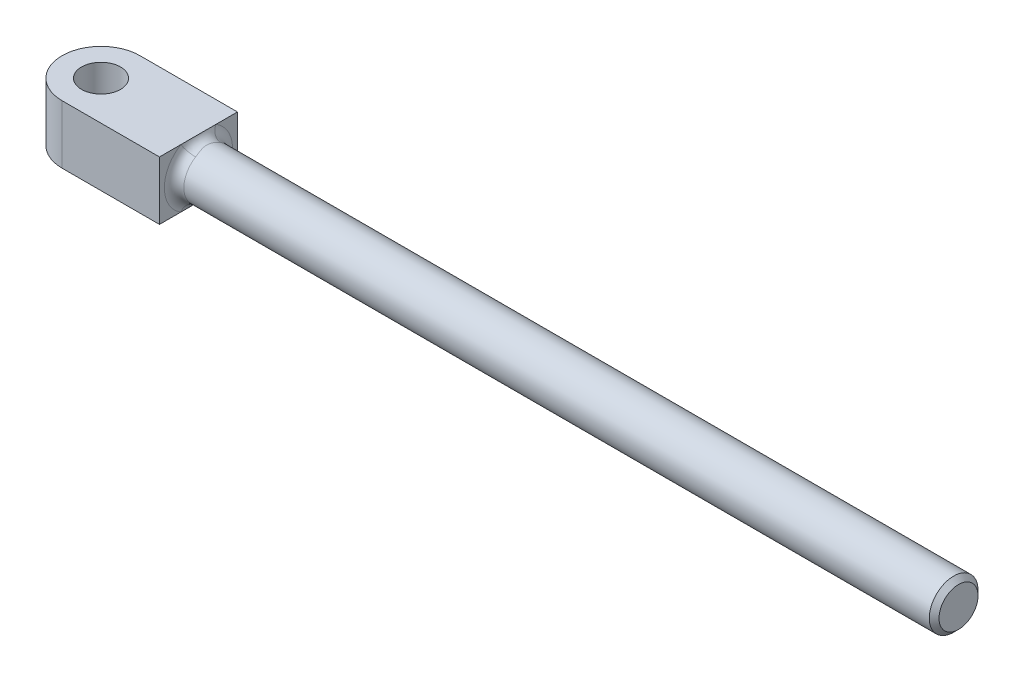
ISO-10303-21;
HEADER;
FILE_DESCRIPTION(('STEP AP214'),'2;1');
FILE_NAME('part.step','',(''),(''),'','','');
FILE_SCHEMA(('AUTOMOTIVE_DESIGN { 1 0 10303 214 1 1 1 1 }'));
ENDSEC;
DATA;
#1=APPLICATION_CONTEXT('core data for automotive mechanical design processes');
#2=APPLICATION_PROTOCOL_DEFINITION('international standard','automotive_design',2000,#1);
#3=PRODUCT_CONTEXT('',#1,'mechanical');
#4=PRODUCT('Part','Part','',(#3));
#5=PRODUCT_RELATED_PRODUCT_CATEGORY('part','',(#4));
#6=PRODUCT_DEFINITION_FORMATION('','',#4);
#7=PRODUCT_DEFINITION_CONTEXT('part definition',#1,'design');
#8=PRODUCT_DEFINITION('design','',#6,#7);
#9=PRODUCT_DEFINITION_SHAPE('','',#8);
#10=(LENGTH_UNIT() NAMED_UNIT(*) SI_UNIT(.MILLI.,.METRE.));
#11=(NAMED_UNIT(*) PLANE_ANGLE_UNIT() SI_UNIT($,.RADIAN.));
#12=(NAMED_UNIT(*) SI_UNIT($,.STERADIAN.) SOLID_ANGLE_UNIT());
#13=UNCERTAINTY_MEASURE_WITH_UNIT(LENGTH_MEASURE(1.E-05),#10,'distance_accuracy_value','');
#14=(GEOMETRIC_REPRESENTATION_CONTEXT(3) GLOBAL_UNCERTAINTY_ASSIGNED_CONTEXT((#13)) GLOBAL_UNIT_ASSIGNED_CONTEXT((#10,
#11,#12)) REPRESENTATION_CONTEXT('',''));
#15=CARTESIAN_POINT('',(0.,0.,0.));
#16=DIRECTION('',(0.,0.,1.));
#17=DIRECTION('',(1.,0.,0.));
#18=AXIS2_PLACEMENT_3D('',#15,#16,#17);
#19=CARTESIAN_POINT('',(5.,3.,-4.));
#20=DIRECTION('',(-1.,0.,0.));
#21=DIRECTION('',(0.,0.,1.));
#22=AXIS2_PLACEMENT_3D('',#19,#20,#21);
#23=PLANE('',#22);
#24=DIRECTION('',(0.,0.,-1.));
#25=VECTOR('',#24,1.);
#26=CARTESIAN_POINT('',(5.,-3.,-4.));
#27=LINE('',#26,#25);
#28=CARTESIAN_POINT('',(5.,-3.,4.));
#29=VERTEX_POINT('',#28);
#30=CARTESIAN_POINT('',(5.,-3.,1.802775637732));
#31=VERTEX_POINT('',#30);
#32=EDGE_CURVE('E259',#29,#31,#27,.T.);
#33=ORIENTED_EDGE('',*,*,#32,.T.);
#34=CARTESIAN_POINT('',(5.,0.,0.));
#35=DIRECTION('',(-1.,0.,0.));
#36=DIRECTION('',(0.,0.,1.));
#37=AXIS2_PLACEMENT_3D('',#34,#35,#36);
#38=CIRCLE('',#37,3.5);
#39=CARTESIAN_POINT('',(5.,3.,1.802775637732));
#40=VERTEX_POINT('',#39);
#41=EDGE_CURVE('E77',#31,#40,#38,.T.);
#42=ORIENTED_EDGE('',*,*,#41,.T.);
#43=DIRECTION('',(0.,0.,-1.));
#44=VECTOR('',#43,1.);
#45=CARTESIAN_POINT('',(5.,3.,-4.));
#46=LINE('',#45,#44);
#47=CARTESIAN_POINT('',(5.,3.,4.));
#48=VERTEX_POINT('',#47);
#49=EDGE_CURVE('E130',#48,#40,#46,.T.);
#50=ORIENTED_EDGE('',*,*,#49,.F.);
#51=DIRECTION('',(0.,-1.,0.));
#52=VECTOR('',#51,1.);
#53=CARTESIAN_POINT('',(5.,3.,4.));
#54=LINE('',#53,#52);
#55=EDGE_CURVE('E261',#48,#29,#54,.T.);
#56=ORIENTED_EDGE('',*,*,#55,.T.);
#57=EDGE_LOOP('',(#33,#42,#50,#56));
#58=FACE_BOUND('',#57,.T.);
#59=ADVANCED_FACE('F52',(#58),#23,.F.);
#60=CARTESIAN_POINT('',(-5.,3.,0.));
#61=DIRECTION('',(0.,1.,0.));
#62=DIRECTION('',(0.,0.,1.));
#63=AXIS2_PLACEMENT_3D('',#60,#61,#62);
#64=PLANE('',#63);
#65=ORIENTED_EDGE('',*,*,#49,.T.);
#66=CARTESIAN_POINT('',(5.,3.,-1.802775637732));
#67=VERTEX_POINT('',#66);
#68=EDGE_CURVE('E125',#40,#67,#46,.T.);
#69=ORIENTED_EDGE('',*,*,#68,.T.);
#70=CARTESIAN_POINT('',(5.,3.,-4.));
#71=VERTEX_POINT('',#70);
#72=EDGE_CURVE('E69',#67,#71,#46,.T.);
#73=ORIENTED_EDGE('',*,*,#72,.T.);
#74=DIRECTION('',(-1.,0.,0.));
#75=VECTOR('',#74,1.);
#76=CARTESIAN_POINT('',(-5.,3.,-4.));
#77=LINE('',#76,#75);
#78=CARTESIAN_POINT('',(-5.,3.,-4.));
#79=VERTEX_POINT('',#78);
#80=EDGE_CURVE('E122',#71,#79,#77,.T.);
#81=ORIENTED_EDGE('',*,*,#80,.T.);
#82=CARTESIAN_POINT('',(-5.,3.,0.));
#83=DIRECTION('',(0.,1.,0.));
#84=DIRECTION('',(0.,0.,1.));
#85=AXIS2_PLACEMENT_3D('',#82,#83,#84);
#86=CIRCLE('',#85,4.);
#87=CARTESIAN_POINT('',(-5.,3.,4.));
#88=VERTEX_POINT('',#87);
#89=EDGE_CURVE('E139',#79,#88,#86,.T.);
#90=ORIENTED_EDGE('',*,*,#89,.T.);
#91=DIRECTION('',(1.,0.,0.));
#92=VECTOR('',#91,1.);
#93=CARTESIAN_POINT('',(-5.,3.,4.));
#94=LINE('',#93,#92);
#95=EDGE_CURVE('E289',#88,#48,#94,.T.);
#96=ORIENTED_EDGE('',*,*,#95,.T.);
#97=EDGE_LOOP('',(#65,#69,#73,#81,#90,#96));
#98=FACE_BOUND('',#97,.T.);
#99=CARTESIAN_POINT('',(-5.,3.,0.));
#100=DIRECTION('',(0.,1.,0.));
#101=DIRECTION('',(0.,0.,1.));
#102=AXIS2_PLACEMENT_3D('',#99,#100,#101);
#103=CIRCLE('',#102,2.);
#104=CARTESIAN_POINT('',(-5.,3.,2.));
#105=VERTEX_POINT('',#104);
#106=EDGE_CURVE('E275',#105,#105,#103,.T.);
#107=ORIENTED_EDGE('',*,*,#106,.F.);
#108=EDGE_LOOP('',(#107));
#109=FACE_BOUND('',#108,.T.);
#110=ADVANCED_FACE('F120',(#98,#109),#64,.T.);
#111=CARTESIAN_POINT('',(-5.,-3.,0.));
#112=DIRECTION('',(0.,1.,0.));
#113=DIRECTION('',(0.,0.,1.));
#114=AXIS2_PLACEMENT_3D('',#111,#112,#113);
#115=PLANE('',#114);
#116=ORIENTED_EDGE('',*,*,#32,.F.);
#117=DIRECTION('',(1.,0.,0.));
#118=VECTOR('',#117,1.);
#119=CARTESIAN_POINT('',(-5.,-3.,4.));
#120=LINE('',#119,#118);
#121=CARTESIAN_POINT('',(-5.,-3.,4.));
#122=VERTEX_POINT('',#121);
#123=EDGE_CURVE('E128',#122,#29,#120,.T.);
#124=ORIENTED_EDGE('',*,*,#123,.F.);
#125=CARTESIAN_POINT('',(-5.,-3.,0.));
#126=DIRECTION('',(0.,1.,0.));
#127=DIRECTION('',(0.,0.,1.));
#128=AXIS2_PLACEMENT_3D('',#125,#126,#127);
#129=CIRCLE('',#128,4.);
#130=CARTESIAN_POINT('',(-5.,-3.,-4.));
#131=VERTEX_POINT('',#130);
#132=EDGE_CURVE('E270',#131,#122,#129,.T.);
#133=ORIENTED_EDGE('',*,*,#132,.F.);
#134=DIRECTION('',(-1.,0.,0.));
#135=VECTOR('',#134,1.);
#136=CARTESIAN_POINT('',(-5.,-3.,-4.));
#137=LINE('',#136,#135);
#138=CARTESIAN_POINT('',(5.,-3.,-4.));
#139=VERTEX_POINT('',#138);
#140=EDGE_CURVE('E265',#139,#131,#137,.T.);
#141=ORIENTED_EDGE('',*,*,#140,.F.);
#142=CARTESIAN_POINT('',(5.,-3.,-1.802775637732));
#143=VERTEX_POINT('',#142);
#144=EDGE_CURVE('E143',#143,#139,#27,.T.);
#145=ORIENTED_EDGE('',*,*,#144,.F.);
#146=EDGE_CURVE('E266',#31,#143,#27,.T.);
#147=ORIENTED_EDGE('',*,*,#146,.F.);
#148=EDGE_LOOP('',(#116,#124,#133,#141,#145,#147));
#149=FACE_BOUND('',#148,.T.);
#150=CARTESIAN_POINT('',(-5.,-3.,0.));
#151=DIRECTION('',(0.,1.,0.));
#152=DIRECTION('',(0.,0.,1.));
#153=AXIS2_PLACEMENT_3D('',#150,#151,#152);
#154=CIRCLE('',#153,2.);
#155=CARTESIAN_POINT('',(-5.,-3.,2.));
#156=VERTEX_POINT('',#155);
#157=EDGE_CURVE('E278',#156,#156,#154,.T.);
#158=ORIENTED_EDGE('',*,*,#157,.T.);
#159=EDGE_LOOP('',(#158));
#160=FACE_BOUND('',#159,.T.);
#161=ADVANCED_FACE('F235',(#149,#160),#115,.F.);
#162=ORIENTED_EDGE('',*,*,#72,.F.);
#163=CARTESIAN_POINT('',(5.,0.,0.));
#164=DIRECTION('',(-1.,0.,0.));
#165=DIRECTION('',(0.,0.,1.));
#166=AXIS2_PLACEMENT_3D('',#163,#164,#165);
#167=CIRCLE('',#166,3.5);
#168=EDGE_CURVE('E206',#67,#143,#167,.T.);
#169=ORIENTED_EDGE('',*,*,#168,.T.);
#170=ORIENTED_EDGE('',*,*,#144,.T.);
#171=DIRECTION('',(0.,-1.,0.));
#172=VECTOR('',#171,1.);
#173=CARTESIAN_POINT('',(5.,3.,-4.));
#174=LINE('',#173,#172);
#175=EDGE_CURVE('E134',#71,#139,#174,.T.);
#176=ORIENTED_EDGE('',*,*,#175,.F.);
#177=EDGE_LOOP('',(#162,#169,#170,#176));
#178=FACE_BOUND('',#177,.T.);
#179=ADVANCED_FACE('F141',(#178),#23,.F.);
#180=CARTESIAN_POINT('',(-5.,3.,-4.));
#181=DIRECTION('',(0.,0.,1.));
#182=DIRECTION('',(1.,0.,0.));
#183=AXIS2_PLACEMENT_3D('',#180,#181,#182);
#184=PLANE('',#183);
#185=ORIENTED_EDGE('',*,*,#140,.T.);
#186=DIRECTION('',(0.,-1.,0.));
#187=VECTOR('',#186,1.);
#188=CARTESIAN_POINT('',(-5.,3.,-4.));
#189=LINE('',#188,#187);
#190=EDGE_CURVE('E136',#79,#131,#189,.T.);
#191=ORIENTED_EDGE('',*,*,#190,.F.);
#192=ORIENTED_EDGE('',*,*,#80,.F.);
#193=ORIENTED_EDGE('',*,*,#175,.T.);
#194=EDGE_LOOP('',(#185,#191,#192,#193));
#195=FACE_BOUND('',#194,.T.);
#196=ADVANCED_FACE('F133',(#195),#184,.F.);
#197=CARTESIAN_POINT('',(-5.,3.,0.));
#198=DIRECTION('',(0.,-1.,0.));
#199=DIRECTION('',(0.,0.,-1.));
#200=AXIS2_PLACEMENT_3D('',#197,#198,#199);
#201=CYLINDRICAL_SURFACE('',#200,4.);
#202=ORIENTED_EDGE('',*,*,#132,.T.);
#203=DIRECTION('',(0.,-1.,0.));
#204=VECTOR('',#203,1.);
#205=CARTESIAN_POINT('',(-5.,3.,4.));
#206=LINE('',#205,#204);
#207=EDGE_CURVE('E152',#88,#122,#206,.T.);
#208=ORIENTED_EDGE('',*,*,#207,.F.);
#209=ORIENTED_EDGE('',*,*,#89,.F.);
#210=ORIENTED_EDGE('',*,*,#190,.T.);
#211=EDGE_LOOP('',(#202,#208,#209,#210));
#212=FACE_BOUND('',#211,.T.);
#213=ADVANCED_FACE('F245',(#212),#201,.T.);
#214=CARTESIAN_POINT('',(-5.,3.,4.));
#215=DIRECTION('',(0.,0.,-1.));
#216=DIRECTION('',(-1.,0.,0.));
#217=AXIS2_PLACEMENT_3D('',#214,#215,#216);
#218=PLANE('',#217);
#219=ORIENTED_EDGE('',*,*,#123,.T.);
#220=ORIENTED_EDGE('',*,*,#55,.F.);
#221=ORIENTED_EDGE('',*,*,#95,.F.);
#222=ORIENTED_EDGE('',*,*,#207,.T.);
#223=EDGE_LOOP('',(#219,#220,#221,#222));
#224=FACE_BOUND('',#223,.T.);
#225=ADVANCED_FACE('F241',(#224),#218,.F.);
#226=CARTESIAN_POINT('',(-5.,3.,0.));
#227=DIRECTION('',(0.,-1.,0.));
#228=DIRECTION('',(0.,0.,-1.));
#229=AXIS2_PLACEMENT_3D('',#226,#227,#228);
#230=CYLINDRICAL_SURFACE('',#229,2.);
#231=ORIENTED_EDGE('',*,*,#106,.T.);
#232=EDGE_LOOP('',(#231));
#233=FACE_BOUND('',#232,.T.);
#234=ORIENTED_EDGE('',*,*,#157,.F.);
#235=EDGE_LOOP('',(#234));
#236=FACE_BOUND('',#235,.T.);
#237=ADVANCED_FACE('F244',(#233,#236),#230,.F.);
#238=CARTESIAN_POINT('',(83.,0.,0.));
#239=DIRECTION('',(-1.,0.,0.));
#240=DIRECTION('',(0.,0.,1.));
#241=AXIS2_PLACEMENT_3D('',#238,#239,#240);
#242=CYLINDRICAL_SURFACE('',#241,2.5);
#243=CARTESIAN_POINT('',(82.5,0.,0.));
#244=DIRECTION('',(1.,0.,0.));
#245=DIRECTION('',(0.,0.,-1.));
#246=AXIS2_PLACEMENT_3D('',#243,#244,#245);
#247=CIRCLE('',#246,2.5);
#248=CARTESIAN_POINT('',(82.5,0.,-2.5));
#249=VERTEX_POINT('',#248);
#250=EDGE_CURVE('E11',#249,#249,#247,.F.);
#251=ORIENTED_EDGE('',*,*,#250,.T.);
#252=EDGE_LOOP('',(#251));
#253=FACE_BOUND('',#252,.T.);
#254=CARTESIAN_POINT('',(6.00000000000001,0.,0.));
#255=DIRECTION('',(-1.,0.,0.));
#256=DIRECTION('',(0.,0.,1.));
#257=AXIS2_PLACEMENT_3D('',#254,#255,#256);
#258=CIRCLE('',#257,2.5);
#259=CARTESIAN_POINT('',(6.00000000000001,2.14285714285714,1.28769688409428));
#260=VERTEX_POINT('',#259);
#261=CARTESIAN_POINT('',(6.00000000000001,-2.14285714285714,1.28769688409428));
#262=VERTEX_POINT('',#261);
#263=EDGE_CURVE('E146',#260,#262,#258,.F.);
#264=ORIENTED_EDGE('',*,*,#263,.T.);
#265=CARTESIAN_POINT('',(5.91020288191499,-1.84702666727615,1.68478262407076));
#266=CARTESIAN_POINT('',(4.59869441592253,-2.11805305184009,1.38765648288614));
#267=CARTESIAN_POINT('',(5.,-3.,2.35869567369907));
#268=CARTESIAN_POINT('',(5.92496343228494,-1.87021882017818,1.65936827293122));
#269=CARTESIAN_POINT('',(4.62986210905236,-2.10409965880879,1.39485788528736));
#270=CARTESIAN_POINT('',(5.,-3.,2.32311558212302));
#271=CARTESIAN_POINT('',(5.93750394487437,-1.89317065476329,1.63314087938531));
#272=CARTESIAN_POINT('',(4.66216951097915,-2.09472768310197,1.39873123079867));
#273=CARTESIAN_POINT('',(5.,-3.,2.28639723116134));
#274=CARTESIAN_POINT('',(5.9586878351196,-1.93827997476054,1.57933264082472));
#275=CARTESIAN_POINT('',(4.72603124317857,-2.08398106756867,1.3997411936574));
#276=CARTESIAN_POINT('',(5.,-3.,2.21106569716946));
#277=CARTESIAN_POINT('',(5.96733950302814,-1.96043905638494,1.55175481528735));
#278=CARTESIAN_POINT('',(4.7575996380689,-2.08237228525282,1.39707606759514));
#279=CARTESIAN_POINT('',(5.,-3.,2.17245674140751));
#280=CARTESIAN_POINT('',(5.98818923016375,-2.02490711609744,1.46788389797564));
#281=CARTESIAN_POINT('',(4.84683976080201,-2.08663625544711,1.38007393620703));
#282=CARTESIAN_POINT('',(5.,-3.,2.05503745715558));
#283=CARTESIAN_POINT('',(5.99559473562002,-2.06575259890432,1.4098581487003));
#284=CARTESIAN_POINT('',(4.90262476341262,-2.10056168474141,1.35734706621003));
#285=CARTESIAN_POINT('',(5.,-3.,1.97380140817703));
#286=CARTESIAN_POINT('',(6.00330042816297,-2.16653078185199,1.25280520925142));
#287=CARTESIAN_POINT('',(5.02820675299698,-2.1515106641981,1.27354998841387));
#288=CARTESIAN_POINT('',(5.,-3.,1.7539272929575));
#289=CARTESIAN_POINT('',(5.99618550299054,-2.22227780908099,1.15097658677616));
#290=CARTESIAN_POINT('',(5.09053797539367,-2.19733566368004,1.19776380716158));
#291=CARTESIAN_POINT('',(5.,-3.,1.61136722148822));
#292=CARTESIAN_POINT('',(5.97148576493426,-2.31925618416503,0.940546919485264));
#293=CARTESIAN_POINT('',(5.18217074895344,-2.28776397044253,1.01589565420035));
#294=CARTESIAN_POINT('',(5.,-3.,1.31676568727776));
#295=CARTESIAN_POINT('',(5.9538221499825,-2.36037452380378,0.831900466571046));
#296=CARTESIAN_POINT('',(5.21371547929332,-2.33312424012959,0.909812051412263));
#297=CARTESIAN_POINT('',(5.,-3.,1.16466065319861));
#298=CARTESIAN_POINT('',(5.92684174644988,-2.41171212801428,0.661443155926719));
#299=CARTESIAN_POINT('',(5.24710827546709,-2.39215410620666,0.732933207563483));
#300=CARTESIAN_POINT('',(5.,-3.,0.926020418297864));
#301=CARTESIAN_POINT('',(5.91744778909948,-2.4274223778965,0.601243759095363));
#302=CARTESIAN_POINT('',(5.25603652297671,-2.41075944684107,0.669088597460024));
#303=CARTESIAN_POINT('',(5.,-3.,0.841741262734452));
#304=CARTESIAN_POINT('',(5.90015966588189,-2.45432605473145,0.47974293897492));
#305=CARTESIAN_POINT('',(5.26996413549231,-2.44303860810299,0.53801459854561));
#306=CARTESIAN_POINT('',(5.,-3.,0.671640114565451));
#307=CARTESIAN_POINT('',(5.89226494845164,-2.46552114449967,0.418441930084311));
#308=CARTESIAN_POINT('',(5.27505468518386,-2.45686188645872,0.470525326937788));
#309=CARTESIAN_POINT('',(5.,-3.,0.585818702117733));
#310=CARTESIAN_POINT('',(5.87924112034305,-2.483274322633,0.29529717472753));
#311=CARTESIAN_POINT('',(5.28255920825161,-2.47886682684453,0.333738205015902));
#312=CARTESIAN_POINT('',(5.,-3.,0.413416044618842));
#313=CARTESIAN_POINT('',(5.87409989352878,-2.48985276592176,0.233457043445556));
#314=CARTESIAN_POINT('',(5.28502791136934,-2.48717845577119,0.264142380679086));
#315=CARTESIAN_POINT('',(5.,-3.,0.326839860825534));
#316=CARTESIAN_POINT('',(5.86735762256748,-2.49838093998099,0.109361414969639));
#317=CARTESIAN_POINT('',(5.28813452010592,-2.49792896303268,0.124128201815257));
#318=CARTESIAN_POINT('',(5.,-3.,0.153105980955934));
#319=CARTESIAN_POINT('',(5.86575622999703,-2.50033112630897,0.0471059592608767));
#320=CARTESIAN_POINT('',(5.28878856741919,-2.5004215525342,0.0533690862010075));
#321=CARTESIAN_POINT('',(5.,-3.,0.0659483429588961));
#322=CARTESIAN_POINT('',(5.8663860932462,-2.49955575223616,-0.0809249677260196));
#323=CARTESIAN_POINT('',(5.28852252488525,-2.4994348313836,-0.0917267287856602));
#324=CARTESIAN_POINT('',(5.,-3.,-0.113294954809735));
#325=CARTESIAN_POINT('',(5.86884135439051,-2.49655692159848,-0.146698507289042));
#326=CARTESIAN_POINT('',(5.2875088539224,-2.49560052172953,-0.166438542504325));
#327=CARTESIAN_POINT('',(5.,-3.,-0.205377910178868));
#328=CARTESIAN_POINT('',(5.87754879251577,-2.48540146107994,-0.277672408532099));
#329=CARTESIAN_POINT('',(5.28333321167597,-2.48158959625075,-0.31385914306642));
#330=CARTESIAN_POINT('',(5.,-3.,-0.388741371970735));
#331=CARTESIAN_POINT('',(5.88380174160464,-2.47724378233976,-0.342872650919743));
#332=CARTESIAN_POINT('',(5.28014630499308,-2.4713346985524,-0.386964129925101));
#333=CARTESIAN_POINT('',(5.,-3.,-0.48002171138414));
#334=CARTESIAN_POINT('',(5.9067535989772,-2.44504355931936,-0.537749623298494));
#335=CARTESIAN_POINT('',(5.26574658259074,-2.43139912857671,-0.603266803000667));
#336=CARTESIAN_POINT('',(5.,-3.,-0.752849472792674));
#337=CARTESIAN_POINT('',(5.9276210150678,-2.41327985383661,-0.665936276663958));
#338=CARTESIAN_POINT('',(5.24942937222351,-2.39210640783797,-0.742186068976898));
#339=CARTESIAN_POINT('',(5.,-3.,-0.932310787375716));
#340=CARTESIAN_POINT('',(5.96740107221333,-2.32918194316109,-0.918065057160637));
#341=CARTESIAN_POINT('',(5.19012910848363,-2.29892237927613,-0.995192101211767));
#342=CARTESIAN_POINT('',(5.,-3.,-1.28529107997795));
#343=CARTESIAN_POINT('',(5.98627540446999,-2.27651421506209,-1.04190105099421));
#344=CARTESIAN_POINT('',(5.14470341554164,-2.24305314597983,-1.11025639067919));
#345=CARTESIAN_POINT('',(5.,-3.,-1.45866147138321));
#346=CARTESIAN_POINT('',(5.99934388681071,-2.18316948515408,-1.21991874616668));
#347=CARTESIAN_POINT('',(5.04729986055641,-2.16884641960793,-1.24485988487909));
#348=CARTESIAN_POINT('',(5.,-3.,-1.70788624463765));
#349=CARTESIAN_POINT('',(6.00118841159584,-2.14987102325301,-1.27769153842256));
#350=CARTESIAN_POINT('',(5.00851870693981,-2.14508379161501,-1.28423049414725));
#351=CARTESIAN_POINT('',(5.,-3.,-1.78876815379293));
#352=CARTESIAN_POINT('',(5.9972190475764,-2.07884509209171,-1.39025899402647));
#353=CARTESIAN_POINT('',(4.91978717962577,-2.10631330259422,-1.34781643223735));
#354=CARTESIAN_POINT('',(5.,-3.,-1.94636259163614));
#355=CARTESIAN_POINT('',(5.99141783619588,-2.04112504867188,-1.44505843077799));
#356=CARTESIAN_POINT('',(4.86917231701612,-2.09160274518387,-1.37150981875895));
#357=CARTESIAN_POINT('',(5.,-3.,-2.02308180308895));
#358=CARTESIAN_POINT('',(5.97128642113735,-1.96987321995236,-1.54025161223535));
#359=CARTESIAN_POINT('',(4.77065378194111,-2.081200774338,-1.39659640419796));
#360=CARTESIAN_POINT('',(5.,-3.,-2.15635225712968));
#361=CARTESIAN_POINT('',(5.9588898280832,-1.93700833370555,-1.58133744408648));
#362=CARTESIAN_POINT('',(4.72351901225179,-2.08277430752351,-1.4010425557338));
#363=CARTESIAN_POINT('',(5.,-3.,-2.21387242172116));
#364=CARTESIAN_POINT('',(5.92518593152543,-1.86941106524607,-1.66075648332884));
#365=CARTESIAN_POINT('',(4.62816871386315,-2.10297416756327,-1.39609191158888));
#366=CARTESIAN_POINT('',(5.,-3.,-2.32505907666029));
#367=CARTESIAN_POINT('',(5.9037801911845,-1.83466186451649,-1.69905362584827));
#368=CARTESIAN_POINT('',(4.57997532214237,-2.12254536468004,-1.38591811782259));
#369=CARTESIAN_POINT('',(5.,-3.,-2.37867507618738));
#370=CARTESIAN_POINT('',(5.87696910277394,-1.79960945399661,-1.73534025859082));
#371=CARTESIAN_POINT('',(4.53620463073676,-2.15360119143179,-1.36823825990708));
#372=CARTESIAN_POINT('',(5.,-3.,-2.42947636202714));
#373=(BOUNDED_SURFACE() B_SPLINE_SURFACE(3,2,((#265,#266,#267),(#268,#269,#270),(#271,#272,
#273),(#274,#275,#276),(#277,#278,#279),(#280,#281,#282),(#283,#284,#285),(#286,#287,#288),
(#289,#290,#291),(#292,#293,#294),(#295,#296,#297),(#298,#299,#300),(#301,#302,#303),(#304,#305,
#306),(#307,#308,#309),(#310,#311,#312),(#313,#314,#315),(#316,#317,#318),(#319,#320,#321),
(#322,#323,#324),(#325,#326,#327),(#328,#329,#330),(#331,#332,#333),(#334,#335,#336),(#337,#338,
#339),(#340,#341,#342),(#343,#344,#345),(#346,#347,#348),(#349,#350,#351),(#352,#353,#354),
(#355,#356,#357),(#358,#359,#360),(#361,#362,#363),(#364,#365,#366),(#367,#368,#369),(#370,#371,
#372)),.UNSPECIFIED.,.F.,.F.,.F.) B_SPLINE_SURFACE_WITH_KNOTS((4,2,2,2,2,2,2,2,2,2,2,2,2,2,2,2,
2,4),(3,3),(0.,0.150978452111825,0.301633503365172,0.599468504271147,1.08493079559651,
1.57406582227359,1.8366775824167,2.09919254100668,2.36054266600817,2.62186706535211,
2.89810917700126,3.17440747024341,3.73017973784788,4.29520076320603,4.57485505395893,
4.85404623174445,5.07750820983559,5.3034779297145),(0.,1.),
.UNSPECIFIED.) GEOMETRIC_REPRESENTATION_ITEM() RATIONAL_B_SPLINE_SURFACE(((1.,0.589072238635039,
1.),(1.,0.597621981679867,1.),(1.,0.606281072137649,1.),(1.,0.623622640940448,1.),(1.,
0.632305029457275,1.),(1.,0.657952795370193,1.),(1.,0.674723639585423,1.),(1.,0.716899899837878,
1.),(1.,0.741089115601709,1.),(1.,0.783806931119416,1.),(1.,0.802291321337426,1.),(1.,
0.825548340664814,1.),(1.,0.832706660558893,1.),(1.,0.845003938290568,1.),(1.,0.850143639514368,
1.),(1.,0.858307963303753,1.),(1.,0.861341869719554,1.),(1.,0.865276991795517,1.),(1.,
0.866178417354905,1.),(1.,0.865820137657809,1.),(1.,0.864434126698028,1.),(1.,0.859289909346192,
1.),(1.,0.855531220558889,1.),(1.,0.840741031559037,1.),(1.,0.826198716210335,1.),(1.,
0.788270185201537,1.),(1.,0.764740823018141,1.),(1.,0.724264523444224,1.),(1.,0.709994983454139,
1.),(1.,0.680153160391985,1.),(1.,0.664583073820699,1.),(1.,0.635979859402373,1.),(1.,
0.623060704128207,1.),(1.,0.597254296383174,1.),(1.,0.58436902895135,1.),(1.,0.571874723989394,1.))) REPRESENTATION_ITEM('') SURFACE());
#374=CARTESIAN_POINT('',(5.91020288191499,-1.84702666727615,1.68478262407076));
#375=CARTESIAN_POINT('',(5.92496343228494,-1.87021882017818,1.65936827293122));
#376=CARTESIAN_POINT('',(5.93750394487437,-1.89317065476329,1.63314087938531));
#377=CARTESIAN_POINT('',(5.9586878351196,-1.93827997476054,1.57933264082472));
#378=CARTESIAN_POINT('',(5.96733950302814,-1.96043905638494,1.55175481528735));
#379=CARTESIAN_POINT('',(5.98818923016375,-2.02490711609744,1.46788389797564));
#380=CARTESIAN_POINT('',(5.99559473562002,-2.06575259890432,1.4098581487003));
#381=CARTESIAN_POINT('',(6.00330042816297,-2.16653078185199,1.25280520925142));
#382=CARTESIAN_POINT('',(5.99618550299054,-2.22227780908099,1.15097658677616));
#383=CARTESIAN_POINT('',(5.97148576493426,-2.31925618416503,0.940546919485264));
#384=CARTESIAN_POINT('',(5.9538221499825,-2.36037452380378,0.831900466571046));
#385=CARTESIAN_POINT('',(5.92684174644988,-2.41171212801428,0.661443155926719));
#386=CARTESIAN_POINT('',(5.91744778909948,-2.4274223778965,0.601243759095364));
#387=CARTESIAN_POINT('',(5.90015966588189,-2.45432605473145,0.47974293897492));
#388=CARTESIAN_POINT('',(5.89226494845164,-2.46552114449967,0.418441930084311));
#389=CARTESIAN_POINT('',(5.87924112034305,-2.483274322633,0.29529717472753));
#390=CARTESIAN_POINT('',(5.87409989352878,-2.48985276592176,0.233457043445556));
#391=CARTESIAN_POINT('',(5.86735762256748,-2.49838093998099,0.109361414969639));
#392=CARTESIAN_POINT('',(5.86575622999703,-2.50033112630897,0.0471059592608767));
#393=CARTESIAN_POINT('',(5.8663860932462,-2.49955575223616,-0.0809249677260196));
#394=CARTESIAN_POINT('',(5.86884135439051,-2.49655692159848,-0.146698507289042));
#395=CARTESIAN_POINT('',(5.87754879251577,-2.48540146107994,-0.277672408532099));
#396=CARTESIAN_POINT('',(5.88380174160464,-2.47724378233976,-0.342872650919743));
#397=CARTESIAN_POINT('',(5.9067535989772,-2.44504355931936,-0.537749623298494));
#398=CARTESIAN_POINT('',(5.92762101506779,-2.41327985383661,-0.665936276663958));
#399=CARTESIAN_POINT('',(5.96740107221333,-2.32918194316109,-0.918065057160637));
#400=CARTESIAN_POINT('',(5.98627540446999,-2.27651421506209,-1.04190105099421));
#401=CARTESIAN_POINT('',(5.99934388681071,-2.18316948515408,-1.21991874616668));
#402=CARTESIAN_POINT('',(6.00118841159584,-2.14987102325301,-1.27769153842256));
#403=CARTESIAN_POINT('',(5.9972190475764,-2.07884509209171,-1.39025899402647));
#404=CARTESIAN_POINT('',(5.99141783619588,-2.04112504867188,-1.44505843077799));
#405=CARTESIAN_POINT('',(5.97128642113735,-1.96987321995236,-1.54025161223535));
#406=CARTESIAN_POINT('',(5.9588898280832,-1.93700833370555,-1.58133744408648));
#407=CARTESIAN_POINT('',(5.92518593152543,-1.86941106524607,-1.66075648332884));
#408=CARTESIAN_POINT('',(5.9037801911845,-1.83466186451649,-1.69905362584827));
#409=CARTESIAN_POINT('',(5.87696910277394,-1.79960945399661,-1.73534025859082));
#410=B_SPLINE_CURVE_WITH_KNOTS('',3,(#374,#375,#376,#377,#378,#379,#380,#381,#382,#383,#384,
#385,#386,#387,#388,#389,#390,#391,#392,#393,#394,#395,#396,#397,#398,#399,#400,#401,#402,#403,
#404,#405,#406,#407,#408,#409),.UNSPECIFIED.,.F.,.F.,(4,2,2,2,2,2,2,2,2,2,2,2,2,2,2,2,2,4),(0.,
0.150978452111825,0.301633503365172,0.599468504271147,1.08493079559651,1.57406582227359,
1.8366775824167,2.09919254100668,2.36054266600817,2.62186706535211,2.89810917700126,
3.17440747024341,3.73017973784788,4.29520076320603,4.57485505395893,4.85404623174445,
5.07750820983559,5.3034779297145),.UNSPECIFIED.);
#411=CARTESIAN_POINT('',(6.00000000000001,-2.14285714285714,-1.28769688409428));
#412=VERTEX_POINT('',#411);
#413=EDGE_CURVE('E209',#262,#412,#410,.T.);
#414=ORIENTED_EDGE('',*,*,#413,.T.);
#415=CARTESIAN_POINT('',(6.00000000000001,0.,0.));
#416=DIRECTION('',(-1.,0.,0.));
#417=DIRECTION('',(0.,0.,1.));
#418=AXIS2_PLACEMENT_3D('',#415,#416,#417);
#419=CIRCLE('',#418,2.5);
#420=CARTESIAN_POINT('',(6.00000000000001,2.14285714285714,-1.28769688409428));
#421=VERTEX_POINT('',#420);
#422=EDGE_CURVE('E164',#412,#421,#419,.F.);
#423=ORIENTED_EDGE('',*,*,#422,.T.);
#424=CARTESIAN_POINT('',(5.91020288191499,1.84702666727615,-1.68478262407076));
#425=CARTESIAN_POINT('',(4.59869441592253,2.11805305184009,-1.38765648288614));
#426=CARTESIAN_POINT('',(5.,3.,-2.35869567369907));
#427=CARTESIAN_POINT('',(5.92496343228494,1.87021882017818,-1.65936827293122));
#428=CARTESIAN_POINT('',(4.62986210905236,2.10409965880879,-1.39485788528736));
#429=CARTESIAN_POINT('',(5.,3.,-2.32311558212302));
#430=CARTESIAN_POINT('',(5.93750394487437,1.89317065476329,-1.63314087938531));
#431=CARTESIAN_POINT('',(4.66216951097915,2.09472768310197,-1.39873123079867));
#432=CARTESIAN_POINT('',(5.,3.,-2.28639723116134));
#433=CARTESIAN_POINT('',(5.9586878351196,1.93827997476054,-1.57933264082472));
#434=CARTESIAN_POINT('',(4.72603124317857,2.08398106756867,-1.3997411936574));
#435=CARTESIAN_POINT('',(5.,3.,-2.21106569716946));
#436=CARTESIAN_POINT('',(5.96733950302814,1.96043905638494,-1.55175481528735));
#437=CARTESIAN_POINT('',(4.7575996380689,2.08237228525282,-1.39707606759514));
#438=CARTESIAN_POINT('',(5.,3.,-2.17245674140751));
#439=CARTESIAN_POINT('',(5.98818923016375,2.02490711609744,-1.46788389797564));
#440=CARTESIAN_POINT('',(4.84683976080201,2.08663625544711,-1.38007393620703));
#441=CARTESIAN_POINT('',(5.,3.,-2.05503745715558));
#442=CARTESIAN_POINT('',(5.99559473562002,2.06575259890432,-1.4098581487003));
#443=CARTESIAN_POINT('',(4.90262476341262,2.10056168474141,-1.35734706621003));
#444=CARTESIAN_POINT('',(5.,3.,-1.97380140817704));
#445=CARTESIAN_POINT('',(6.00330042816297,2.16653078185199,-1.25280520925142));
#446=CARTESIAN_POINT('',(5.02820675299698,2.1515106641981,-1.27354998841387));
#447=CARTESIAN_POINT('',(5.,3.,-1.7539272929575));
#448=CARTESIAN_POINT('',(5.99618550299054,2.22227780908099,-1.15097658677616));
#449=CARTESIAN_POINT('',(5.09053797539367,2.19733566368004,-1.19776380716158));
#450=CARTESIAN_POINT('',(5.,3.,-1.61136722148822));
#451=CARTESIAN_POINT('',(5.97148576493426,2.31925618416503,-0.940546919485264));
#452=CARTESIAN_POINT('',(5.18217074895344,2.28776397044253,-1.01589565420035));
#453=CARTESIAN_POINT('',(5.,3.,-1.31676568727776));
#454=CARTESIAN_POINT('',(5.9538221499825,2.36037452380378,-0.831900466571046));
#455=CARTESIAN_POINT('',(5.21371547929332,2.33312424012959,-0.909812051412263));
#456=CARTESIAN_POINT('',(5.,3.,-1.16466065319861));
#457=CARTESIAN_POINT('',(5.92684174644988,2.41171212801428,-0.661443155926719));
#458=CARTESIAN_POINT('',(5.24710827546709,2.39215410620666,-0.732933207563483));
#459=CARTESIAN_POINT('',(5.,3.,-0.926020418297864));
#460=CARTESIAN_POINT('',(5.91744778909948,2.4274223778965,-0.601243759095363));
#461=CARTESIAN_POINT('',(5.25603652297671,2.41075944684107,-0.669088597460024));
#462=CARTESIAN_POINT('',(5.,3.,-0.841741262734452));
#463=CARTESIAN_POINT('',(5.90015966588189,2.45432605473145,-0.47974293897492));
#464=CARTESIAN_POINT('',(5.26996413549231,2.44303860810299,-0.53801459854561));
#465=CARTESIAN_POINT('',(5.,3.,-0.671640114565451));
#466=CARTESIAN_POINT('',(5.89226494845164,2.46552114449967,-0.418441930084311));
#467=CARTESIAN_POINT('',(5.27505468518386,2.45686188645872,-0.470525326937788));
#468=CARTESIAN_POINT('',(5.,3.,-0.585818702117733));
#469=CARTESIAN_POINT('',(5.87924112034305,2.483274322633,-0.29529717472753));
#470=CARTESIAN_POINT('',(5.28255920825161,2.47886682684453,-0.333738205015902));
#471=CARTESIAN_POINT('',(5.,3.,-0.413416044618842));
#472=CARTESIAN_POINT('',(5.87409989352878,2.48985276592176,-0.233457043445556));
#473=CARTESIAN_POINT('',(5.28502791136934,2.48717845577119,-0.264142380679086));
#474=CARTESIAN_POINT('',(5.,3.,-0.326839860825534));
#475=CARTESIAN_POINT('',(5.86735762256748,2.49838093998099,-0.109361414969639));
#476=CARTESIAN_POINT('',(5.28813452010592,2.49792896303268,-0.124128201815257));
#477=CARTESIAN_POINT('',(5.,3.,-0.153105980955934));
#478=CARTESIAN_POINT('',(5.86575622999703,2.50033112630897,-0.0471059592608767));
#479=CARTESIAN_POINT('',(5.28878856741919,2.5004215525342,-0.0533690862010075));
#480=CARTESIAN_POINT('',(5.,3.,-0.0659483429588961));
#481=CARTESIAN_POINT('',(5.8663860932462,2.49955575223616,0.0809249677260196));
#482=CARTESIAN_POINT('',(5.28852252488525,2.4994348313836,0.0917267287856602));
#483=CARTESIAN_POINT('',(5.,3.,0.113294954809735));
#484=CARTESIAN_POINT('',(5.86884135439051,2.49655692159848,0.146698507289042));
#485=CARTESIAN_POINT('',(5.2875088539224,2.49560052172953,0.166438542504325));
#486=CARTESIAN_POINT('',(5.,3.,0.205377910178868));
#487=CARTESIAN_POINT('',(5.87754879251577,2.48540146107994,0.277672408532099));
#488=CARTESIAN_POINT('',(5.28333321167597,2.48158959625075,0.31385914306642));
#489=CARTESIAN_POINT('',(5.,3.,0.388741371970735));
#490=CARTESIAN_POINT('',(5.88380174160464,2.47724378233976,0.342872650919743));
#491=CARTESIAN_POINT('',(5.28014630499308,2.4713346985524,0.386964129925101));
#492=CARTESIAN_POINT('',(5.,3.,0.48002171138414));
#493=CARTESIAN_POINT('',(5.9067535989772,2.44504355931936,0.537749623298494));
#494=CARTESIAN_POINT('',(5.26574658259074,2.43139912857671,0.603266803000667));
#495=CARTESIAN_POINT('',(5.,3.,0.752849472792674));
#496=CARTESIAN_POINT('',(5.9276210150678,2.41327985383661,0.665936276663958));
#497=CARTESIAN_POINT('',(5.24942937222351,2.39210640783797,0.742186068976898));
#498=CARTESIAN_POINT('',(5.,3.,0.932310787375716));
#499=CARTESIAN_POINT('',(5.96740107221333,2.32918194316109,0.918065057160637));
#500=CARTESIAN_POINT('',(5.19012910848363,2.29892237927613,0.995192101211767));
#501=CARTESIAN_POINT('',(5.,3.,1.28529107997795));
#502=CARTESIAN_POINT('',(5.98627540446999,2.27651421506209,1.04190105099421));
#503=CARTESIAN_POINT('',(5.14470341554164,2.24305314597983,1.11025639067919));
#504=CARTESIAN_POINT('',(5.,3.,1.45866147138321));
#505=CARTESIAN_POINT('',(5.99934388681071,2.18316948515408,1.21991874616668));
#506=CARTESIAN_POINT('',(5.04729986055641,2.16884641960793,1.24485988487909));
#507=CARTESIAN_POINT('',(5.,3.,1.70788624463765));
#508=CARTESIAN_POINT('',(6.00118841159584,2.14987102325301,1.27769153842256));
#509=CARTESIAN_POINT('',(5.00851870693981,2.14508379161501,1.28423049414725));
#510=CARTESIAN_POINT('',(5.,3.,1.78876815379293));
#511=CARTESIAN_POINT('',(5.9972190475764,2.07884509209171,1.39025899402647));
#512=CARTESIAN_POINT('',(4.91978717962578,2.10631330259422,1.34781643223735));
#513=CARTESIAN_POINT('',(5.,3.,1.94636259163614));
#514=CARTESIAN_POINT('',(5.99141783619588,2.04112504867188,1.44505843077799));
#515=CARTESIAN_POINT('',(4.86917231701612,2.09160274518387,1.37150981875895));
#516=CARTESIAN_POINT('',(5.,3.,2.02308180308895));
#517=CARTESIAN_POINT('',(5.97128642113735,1.96987321995236,1.54025161223535));
#518=CARTESIAN_POINT('',(4.77065378194111,2.081200774338,1.39659640419796));
#519=CARTESIAN_POINT('',(5.,3.,2.15635225712968));
#520=CARTESIAN_POINT('',(5.9588898280832,1.93700833370555,1.58133744408648));
#521=CARTESIAN_POINT('',(4.72351901225179,2.08277430752351,1.4010425557338));
#522=CARTESIAN_POINT('',(5.,3.,2.21387242172116));
#523=CARTESIAN_POINT('',(5.92518593152543,1.86941106524607,1.66075648332884));
#524=CARTESIAN_POINT('',(4.62816871386315,2.10297416756327,1.39609191158888));
#525=CARTESIAN_POINT('',(5.,3.,2.32505907666029));
#526=CARTESIAN_POINT('',(5.9037801911845,1.83466186451649,1.69905362584827));
#527=CARTESIAN_POINT('',(4.57997532214236,2.12254536468004,1.38591811782259));
#528=CARTESIAN_POINT('',(5.,3.,2.37867507618738));
#529=CARTESIAN_POINT('',(5.87696910277394,1.79960945399661,1.73534025859082));
#530=CARTESIAN_POINT('',(4.53620463073676,2.15360119143179,1.36823825990708));
#531=CARTESIAN_POINT('',(5.,3.,2.42947636202714));
#532=(BOUNDED_SURFACE() B_SPLINE_SURFACE(3,2,((#424,#425,#426),(#427,#428,#429),(#430,#431,
#432),(#433,#434,#435),(#436,#437,#438),(#439,#440,#441),(#442,#443,#444),(#445,#446,#447),
(#448,#449,#450),(#451,#452,#453),(#454,#455,#456),(#457,#458,#459),(#460,#461,#462),(#463,#464,
#465),(#466,#467,#468),(#469,#470,#471),(#472,#473,#474),(#475,#476,#477),(#478,#479,#480),
(#481,#482,#483),(#484,#485,#486),(#487,#488,#489),(#490,#491,#492),(#493,#494,#495),(#496,#497,
#498),(#499,#500,#501),(#502,#503,#504),(#505,#506,#507),(#508,#509,#510),(#511,#512,#513),
(#514,#515,#516),(#517,#518,#519),(#520,#521,#522),(#523,#524,#525),(#526,#527,#528),(#529,#530,
#531)),.UNSPECIFIED.,.F.,.F.,.F.) B_SPLINE_SURFACE_WITH_KNOTS((4,2,2,2,2,2,2,2,2,2,2,2,2,2,2,2,
2,4),(3,3),(0.,0.150978452111825,0.301633503365172,0.599468504271147,1.08493079559651,
1.57406582227359,1.8366775824167,2.09919254100668,2.36054266600817,2.62186706535211,
2.89810917700126,3.17440747024341,3.73017973784788,4.29520076320603,4.57485505395893,
4.85404623174445,5.07750820983559,5.3034779297145),(0.,1.),
.UNSPECIFIED.) GEOMETRIC_REPRESENTATION_ITEM() RATIONAL_B_SPLINE_SURFACE(((1.,0.589072238635039,
1.),(1.,0.597621981679867,1.),(1.,0.606281072137649,1.),(1.,0.623622640940448,1.),(1.,
0.632305029457275,1.),(1.,0.657952795370194,1.),(1.,0.674723639585423,1.),(1.,0.716899899837877,
1.),(1.,0.741089115601709,1.),(1.,0.783806931119416,1.),(1.,0.802291321337426,1.),(1.,
0.825548340664814,1.),(1.,0.832706660558893,1.),(1.,0.845003938290568,1.),(1.,0.850143639514368,
1.),(1.,0.858307963303753,1.),(1.,0.861341869719554,1.),(1.,0.865276991795517,1.),(1.,
0.866178417354905,1.),(1.,0.865820137657809,1.),(1.,0.864434126698028,1.),(1.,0.859289909346192,
1.),(1.,0.855531220558889,1.),(1.,0.840741031559037,1.),(1.,0.826198716210335,1.),(1.,
0.788270185201537,1.),(1.,0.764740823018141,1.),(1.,0.724264523444224,1.),(1.,0.709994983454139,
1.),(1.,0.680153160391985,1.),(1.,0.664583073820699,1.),(1.,0.635979859402373,1.),(1.,
0.623060704128207,1.),(1.,0.597254296383174,1.),(1.,0.58436902895135,1.),(1.,0.571874723989394,1.))) REPRESENTATION_ITEM('') SURFACE());
#533=CARTESIAN_POINT('',(5.91020288191499,1.84702666727615,-1.68478262407076));
#534=CARTESIAN_POINT('',(5.92496343228494,1.87021882017818,-1.65936827293122));
#535=CARTESIAN_POINT('',(5.93750394487437,1.89317065476329,-1.63314087938531));
#536=CARTESIAN_POINT('',(5.9586878351196,1.93827997476054,-1.57933264082472));
#537=CARTESIAN_POINT('',(5.96733950302814,1.96043905638494,-1.55175481528735));
#538=CARTESIAN_POINT('',(5.98818923016375,2.02490711609744,-1.46788389797564));
#539=CARTESIAN_POINT('',(5.99559473562002,2.06575259890432,-1.4098581487003));
#540=CARTESIAN_POINT('',(6.00330042816297,2.16653078185199,-1.25280520925142));
#541=CARTESIAN_POINT('',(5.99618550299054,2.22227780908099,-1.15097658677616));
#542=CARTESIAN_POINT('',(5.97148576493426,2.31925618416503,-0.940546919485264));
#543=CARTESIAN_POINT('',(5.9538221499825,2.36037452380378,-0.831900466571046));
#544=CARTESIAN_POINT('',(5.92684174644988,2.41171212801428,-0.661443155926719));
#545=CARTESIAN_POINT('',(5.91744778909948,2.4274223778965,-0.601243759095364));
#546=CARTESIAN_POINT('',(5.90015966588189,2.45432605473145,-0.47974293897492));
#547=CARTESIAN_POINT('',(5.89226494845164,2.46552114449967,-0.418441930084311));
#548=CARTESIAN_POINT('',(5.87924112034305,2.483274322633,-0.29529717472753));
#549=CARTESIAN_POINT('',(5.87409989352878,2.48985276592176,-0.233457043445556));
#550=CARTESIAN_POINT('',(5.86735762256748,2.49838093998099,-0.109361414969639));
#551=CARTESIAN_POINT('',(5.86575622999703,2.50033112630897,-0.0471059592608767));
#552=CARTESIAN_POINT('',(5.8663860932462,2.49955575223616,0.0809249677260196));
#553=CARTESIAN_POINT('',(5.86884135439051,2.49655692159848,0.146698507289042));
#554=CARTESIAN_POINT('',(5.87754879251577,2.48540146107994,0.277672408532099));
#555=CARTESIAN_POINT('',(5.88380174160464,2.47724378233976,0.342872650919743));
#556=CARTESIAN_POINT('',(5.9067535989772,2.44504355931936,0.537749623298494));
#557=CARTESIAN_POINT('',(5.92762101506779,2.41327985383661,0.665936276663958));
#558=CARTESIAN_POINT('',(5.96740107221333,2.32918194316109,0.918065057160637));
#559=CARTESIAN_POINT('',(5.98627540446999,2.27651421506209,1.04190105099421));
#560=CARTESIAN_POINT('',(5.99934388681071,2.18316948515408,1.21991874616668));
#561=CARTESIAN_POINT('',(6.00118841159584,2.14987102325301,1.27769153842256));
#562=CARTESIAN_POINT('',(5.9972190475764,2.07884509209171,1.39025899402647));
#563=CARTESIAN_POINT('',(5.99141783619588,2.04112504867188,1.44505843077799));
#564=CARTESIAN_POINT('',(5.97128642113735,1.96987321995236,1.54025161223535));
#565=CARTESIAN_POINT('',(5.9588898280832,1.93700833370555,1.58133744408648));
#566=CARTESIAN_POINT('',(5.92518593152543,1.86941106524607,1.66075648332884));
#567=CARTESIAN_POINT('',(5.9037801911845,1.83466186451649,1.69905362584827));
#568=CARTESIAN_POINT('',(5.87696910277394,1.79960945399661,1.73534025859082));
#569=B_SPLINE_CURVE_WITH_KNOTS('',3,(#533,#534,#535,#536,#537,#538,#539,#540,#541,#542,#543,
#544,#545,#546,#547,#548,#549,#550,#551,#552,#553,#554,#555,#556,#557,#558,#559,#560,#561,#562,
#563,#564,#565,#566,#567,#568),.UNSPECIFIED.,.F.,.F.,(4,2,2,2,2,2,2,2,2,2,2,2,2,2,2,2,2,4),(0.,
0.150978452111825,0.301633503365172,0.599468504271147,1.08493079559651,1.57406582227359,
1.8366775824167,2.09919254100668,2.36054266600817,2.62186706535211,2.89810917700126,
3.17440747024341,3.73017973784788,4.29520076320603,4.57485505395893,4.85404623174445,
5.07750820983559,5.3034779297145),.UNSPECIFIED.);
#570=EDGE_CURVE('E150',#421,#260,#569,.T.);
#571=ORIENTED_EDGE('',*,*,#570,.T.);
#572=EDGE_LOOP('',(#264,#414,#423,#571));
#573=FACE_BOUND('',#572,.T.);
#574=ADVANCED_FACE('F166',(#253,#573),#242,.T.);
#575=CARTESIAN_POINT('',(83.,0.,0.));
#576=DIRECTION('',(1.,0.,0.));
#577=DIRECTION('',(0.,0.,-1.));
#578=AXIS2_PLACEMENT_3D('',#575,#576,#577);
#579=PLANE('',#578);
#580=CARTESIAN_POINT('',(83.,0.,0.));
#581=DIRECTION('',(1.,0.,0.));
#582=DIRECTION('',(0.,0.,-1.));
#583=AXIS2_PLACEMENT_3D('',#580,#581,#582);
#584=CIRCLE('',#583,2.);
#585=CARTESIAN_POINT('',(83.,0.,-2.));
#586=VERTEX_POINT('',#585);
#587=EDGE_CURVE('E62',#586,#586,#584,.T.);
#588=ORIENTED_EDGE('',*,*,#587,.T.);
#589=EDGE_LOOP('',(#588));
#590=FACE_BOUND('',#589,.T.);
#591=ADVANCED_FACE('F185',(#590),#579,.T.);
#592=CARTESIAN_POINT('',(6.,3.,-1.802775637732));
#593=DIRECTION('',(0.,-0.515078753637713,-0.857142857142857));
#594=DIRECTION('',(0.,0.857142857142857,-0.515078753637713));
#595=AXIS2_PLACEMENT_3D('',#592,#593,#594);
#596=CIRCLE('',#595,1.);
#597=EDGE_CURVE('E218',#67,#421,#596,.F.);
#598=ORIENTED_EDGE('',*,*,#597,.F.);
#599=ORIENTED_EDGE('',*,*,#68,.F.);
#600=CARTESIAN_POINT('',(6.,3.00000000000052,1.80277563773113));
#601=DIRECTION('',(-2.67832381972058E-13,0.515078753637466,-0.857142857143006));
#602=DIRECTION('',(0.,0.857142857143006,0.515078753637466));
#603=AXIS2_PLACEMENT_3D('',#600,#601,#602);
#604=CIRCLE('',#603,1.);
#605=EDGE_CURVE('E284',#260,#40,#604,.T.);
#606=ORIENTED_EDGE('',*,*,#605,.F.);
#607=ORIENTED_EDGE('',*,*,#570,.F.);
#608=EDGE_LOOP('',(#598,#599,#606,#607));
#609=FACE_BOUND('',#608,.T.);
#610=ADVANCED_FACE('F178',(#609),#532,.F.);
#611=CARTESIAN_POINT('',(6.00000000000001,0.,0.));
#612=DIRECTION('',(-1.,0.,0.));
#613=DIRECTION('',(0.,0.,1.));
#614=AXIS2_PLACEMENT_3D('',#611,#612,#613);
#615=TOROIDAL_SURFACE('',#614,3.5,1.);
#616=ORIENTED_EDGE('',*,*,#605,.T.);
#617=ORIENTED_EDGE('',*,*,#41,.F.);
#618=CARTESIAN_POINT('',(6.00000000000001,-3.,1.802775637732));
#619=DIRECTION('',(0.,0.515078753637713,0.857142857142857));
#620=DIRECTION('',(0.,-0.857142857142857,0.515078753637713));
#621=AXIS2_PLACEMENT_3D('',#618,#619,#620);
#622=CIRCLE('',#621,1.);
#623=EDGE_CURVE('E215',#262,#31,#622,.T.);
#624=ORIENTED_EDGE('',*,*,#623,.F.);
#625=ORIENTED_EDGE('',*,*,#263,.F.);
#626=EDGE_LOOP('',(#616,#617,#624,#625));
#627=FACE_BOUND('',#626,.T.);
#628=ADVANCED_FACE('F184',(#627),#615,.F.);
#629=CARTESIAN_POINT('',(6.00000000000001,0.,0.));
#630=DIRECTION('',(-1.,0.,0.));
#631=DIRECTION('',(0.,0.,1.));
#632=AXIS2_PLACEMENT_3D('',#629,#630,#631);
#633=TOROIDAL_SURFACE('',#632,3.5,1.);
#634=ORIENTED_EDGE('',*,*,#597,.T.);
#635=ORIENTED_EDGE('',*,*,#422,.F.);
#636=CARTESIAN_POINT('',(6.,-3.,-1.802775637732));
#637=DIRECTION('',(0.,0.515078753637713,-0.857142857142857));
#638=DIRECTION('',(0.,0.857142857142857,0.515078753637713));
#639=AXIS2_PLACEMENT_3D('',#636,#637,#638);
#640=CIRCLE('',#639,1.);
#641=EDGE_CURVE('E212',#143,#412,#640,.T.);
#642=ORIENTED_EDGE('',*,*,#641,.F.);
#643=ORIENTED_EDGE('',*,*,#168,.F.);
#644=EDGE_LOOP('',(#634,#635,#642,#643));
#645=FACE_BOUND('',#644,.T.);
#646=ADVANCED_FACE('F335',(#645),#633,.F.);
#647=ORIENTED_EDGE('',*,*,#623,.T.);
#648=ORIENTED_EDGE('',*,*,#146,.T.);
#649=ORIENTED_EDGE('',*,*,#641,.T.);
#650=ORIENTED_EDGE('',*,*,#413,.F.);
#651=EDGE_LOOP('',(#647,#648,#649,#650));
#652=FACE_BOUND('',#651,.T.);
#653=ADVANCED_FACE('F232',(#652),#373,.F.);
#654=CARTESIAN_POINT('',(83.,0.,0.));
#655=DIRECTION('',(-1.,0.,0.));
#656=DIRECTION('',(0.,0.,1.));
#657=AXIS2_PLACEMENT_3D('',#654,#655,#656);
#658=CONICAL_SURFACE('',#657,2.,0.785398163397446);
#659=ORIENTED_EDGE('',*,*,#250,.F.);
#660=EDGE_LOOP('',(#659));
#661=FACE_BOUND('',#660,.T.);
#662=ORIENTED_EDGE('',*,*,#587,.F.);
#663=EDGE_LOOP('',(#662));
#664=FACE_BOUND('',#663,.T.);
#665=ADVANCED_FACE('F55',(#661,#664),#658,.T.);
#666=CLOSED_SHELL('',(#59,#110,#161,#179,#196,#213,#225,#237,#574,#591,#610,#628,#646,#653,#665));
#667=MANIFOLD_SOLID_BREP('B2',#666);
#668=ADVANCED_BREP_SHAPE_REPRESENTATION('',(#18,#667),#14);
#669=SHAPE_DEFINITION_REPRESENTATION(#9,#668);
ENDSEC;
END-ISO-10303-21;
